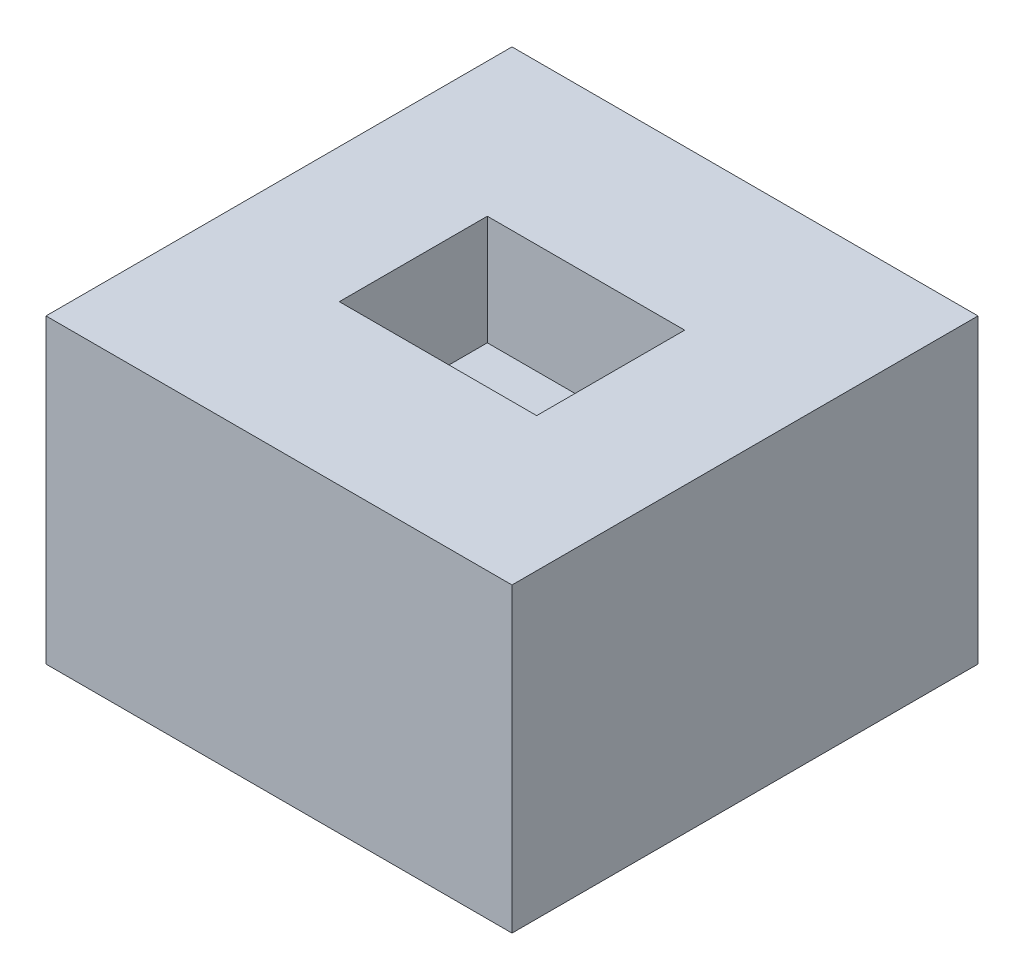
ISO-10303-21;
HEADER;
FILE_DESCRIPTION(('STEP AP214'),'2;1');
FILE_NAME('part.step','',(''),(''),'','','');
FILE_SCHEMA(('AUTOMOTIVE_DESIGN { 1 0 10303 214 1 1 1 1 }'));
ENDSEC;
DATA;
#1=APPLICATION_CONTEXT('core data for automotive mechanical design processes');
#2=APPLICATION_PROTOCOL_DEFINITION('international standard','automotive_design',2000,#1);
#3=PRODUCT_CONTEXT('',#1,'mechanical');
#4=PRODUCT('Part','Part','',(#3));
#5=PRODUCT_RELATED_PRODUCT_CATEGORY('part','',(#4));
#6=PRODUCT_DEFINITION_FORMATION('','',#4);
#7=PRODUCT_DEFINITION_CONTEXT('part definition',#1,'design');
#8=PRODUCT_DEFINITION('design','',#6,#7);
#9=PRODUCT_DEFINITION_SHAPE('','',#8);
#10=(LENGTH_UNIT() NAMED_UNIT(*) SI_UNIT(.MILLI.,.METRE.));
#11=(NAMED_UNIT(*) PLANE_ANGLE_UNIT() SI_UNIT($,.RADIAN.));
#12=(NAMED_UNIT(*) SI_UNIT($,.STERADIAN.) SOLID_ANGLE_UNIT());
#13=UNCERTAINTY_MEASURE_WITH_UNIT(LENGTH_MEASURE(1.E-05),#10,'distance_accuracy_value','');
#14=(GEOMETRIC_REPRESENTATION_CONTEXT(3) GLOBAL_UNCERTAINTY_ASSIGNED_CONTEXT((#13)) GLOBAL_UNIT_ASSIGNED_CONTEXT((#10,
#11,#12)) REPRESENTATION_CONTEXT('',''));
#15=CARTESIAN_POINT('',(0.,0.,0.));
#16=DIRECTION('',(0.,0.,1.));
#17=DIRECTION('',(1.,0.,0.));
#18=AXIS2_PLACEMENT_3D('',#15,#16,#17);
#19=CARTESIAN_POINT('',(-4.25,5.5,4.25));
#20=DIRECTION('',(1.,0.,0.));
#21=DIRECTION('',(0.,0.,-1.));
#22=AXIS2_PLACEMENT_3D('',#19,#20,#21);
#23=PLANE('',#22);
#24=DIRECTION('',(0.,0.,1.));
#25=VECTOR('',#24,1.);
#26=CARTESIAN_POINT('',(-4.25,0.,4.25));
#27=LINE('',#26,#25);
#28=CARTESIAN_POINT('',(-4.25,0.,-4.25));
#29=VERTEX_POINT('',#28);
#30=CARTESIAN_POINT('',(-4.25,0.,4.25));
#31=VERTEX_POINT('',#30);
#32=EDGE_CURVE('E145',#29,#31,#27,.T.);
#33=ORIENTED_EDGE('',*,*,#32,.T.);
#34=DIRECTION('',(0.,-1.,0.));
#35=VECTOR('',#34,1.);
#36=CARTESIAN_POINT('',(-4.25,5.5,4.25));
#37=LINE('',#36,#35);
#38=CARTESIAN_POINT('',(-4.25,5.5,4.25));
#39=VERTEX_POINT('',#38);
#40=EDGE_CURVE('E11',#39,#31,#37,.T.);
#41=ORIENTED_EDGE('',*,*,#40,.F.);
#42=DIRECTION('',(0.,0.,1.));
#43=VECTOR('',#42,1.);
#44=CARTESIAN_POINT('',(-4.25,5.5,4.25));
#45=LINE('',#44,#43);
#46=CARTESIAN_POINT('',(-4.25,5.5,-4.25));
#47=VERTEX_POINT('',#46);
#48=EDGE_CURVE('E149',#47,#39,#45,.T.);
#49=ORIENTED_EDGE('',*,*,#48,.F.);
#50=DIRECTION('',(0.,-1.,0.));
#51=VECTOR('',#50,1.);
#52=CARTESIAN_POINT('',(-4.25,5.5,-4.25));
#53=LINE('',#52,#51);
#54=EDGE_CURVE('E155',#47,#29,#53,.T.);
#55=ORIENTED_EDGE('',*,*,#54,.T.);
#56=EDGE_LOOP('',(#33,#41,#49,#55));
#57=FACE_BOUND('',#56,.T.);
#58=ADVANCED_FACE('F37',(#57),#23,.F.);
#59=CARTESIAN_POINT('',(4.25,5.5,4.25));
#60=DIRECTION('',(0.,0.,-1.));
#61=DIRECTION('',(-1.,0.,0.));
#62=AXIS2_PLACEMENT_3D('',#59,#60,#61);
#63=PLANE('',#62);
#64=DIRECTION('',(1.,0.,0.));
#65=VECTOR('',#64,1.);
#66=CARTESIAN_POINT('',(4.25,0.,4.25));
#67=LINE('',#66,#65);
#68=CARTESIAN_POINT('',(4.25,0.,4.25));
#69=VERTEX_POINT('',#68);
#70=EDGE_CURVE('E158',#31,#69,#67,.T.);
#71=ORIENTED_EDGE('',*,*,#70,.T.);
#72=DIRECTION('',(0.,-1.,0.));
#73=VECTOR('',#72,1.);
#74=CARTESIAN_POINT('',(4.25,5.5,4.25));
#75=LINE('',#74,#73);
#76=CARTESIAN_POINT('',(4.25,5.5,4.25));
#77=VERTEX_POINT('',#76);
#78=EDGE_CURVE('E44',#77,#69,#75,.T.);
#79=ORIENTED_EDGE('',*,*,#78,.F.);
#80=DIRECTION('',(1.,0.,0.));
#81=VECTOR('',#80,1.);
#82=CARTESIAN_POINT('',(4.25,5.5,4.25));
#83=LINE('',#82,#81);
#84=EDGE_CURVE('E88',#39,#77,#83,.T.);
#85=ORIENTED_EDGE('',*,*,#84,.F.);
#86=ORIENTED_EDGE('',*,*,#40,.T.);
#87=EDGE_LOOP('',(#71,#79,#85,#86));
#88=FACE_BOUND('',#87,.T.);
#89=ADVANCED_FACE('F188',(#88),#63,.F.);
#90=CARTESIAN_POINT('',(4.25,5.5,4.25));
#91=DIRECTION('',(-1.,0.,0.));
#92=DIRECTION('',(0.,0.,1.));
#93=AXIS2_PLACEMENT_3D('',#90,#91,#92);
#94=PLANE('',#93);
#95=DIRECTION('',(0.,0.,-1.));
#96=VECTOR('',#95,1.);
#97=CARTESIAN_POINT('',(4.25,0.,4.25));
#98=LINE('',#97,#96);
#99=CARTESIAN_POINT('',(4.25,0.,-4.25));
#100=VERTEX_POINT('',#99);
#101=EDGE_CURVE('E160',#69,#100,#98,.T.);
#102=ORIENTED_EDGE('',*,*,#101,.T.);
#103=DIRECTION('',(0.,-1.,0.));
#104=VECTOR('',#103,1.);
#105=CARTESIAN_POINT('',(4.25,5.5,-4.25));
#106=LINE('',#105,#104);
#107=CARTESIAN_POINT('',(4.25,5.5,-4.25));
#108=VERTEX_POINT('',#107);
#109=EDGE_CURVE('E164',#108,#100,#106,.T.);
#110=ORIENTED_EDGE('',*,*,#109,.F.);
#111=DIRECTION('',(0.,0.,-1.));
#112=VECTOR('',#111,1.);
#113=CARTESIAN_POINT('',(4.25,5.5,4.25));
#114=LINE('',#113,#112);
#115=EDGE_CURVE('E152',#77,#108,#114,.T.);
#116=ORIENTED_EDGE('',*,*,#115,.F.);
#117=ORIENTED_EDGE('',*,*,#78,.T.);
#118=EDGE_LOOP('',(#102,#110,#116,#117));
#119=FACE_BOUND('',#118,.T.);
#120=ADVANCED_FACE('F169',(#119),#94,.F.);
#121=CARTESIAN_POINT('',(4.25,5.5,-4.25));
#122=DIRECTION('',(0.,0.,1.));
#123=DIRECTION('',(1.,0.,0.));
#124=AXIS2_PLACEMENT_3D('',#121,#122,#123);
#125=PLANE('',#124);
#126=DIRECTION('',(-1.,0.,0.));
#127=VECTOR('',#126,1.);
#128=CARTESIAN_POINT('',(4.25,0.,-4.25));
#129=LINE('',#128,#127);
#130=EDGE_CURVE('E81',#100,#29,#129,.T.);
#131=ORIENTED_EDGE('',*,*,#130,.T.);
#132=ORIENTED_EDGE('',*,*,#54,.F.);
#133=DIRECTION('',(-1.,0.,0.));
#134=VECTOR('',#133,1.);
#135=CARTESIAN_POINT('',(4.25,5.5,-4.25));
#136=LINE('',#135,#134);
#137=EDGE_CURVE('E60',#108,#47,#136,.T.);
#138=ORIENTED_EDGE('',*,*,#137,.F.);
#139=ORIENTED_EDGE('',*,*,#109,.T.);
#140=EDGE_LOOP('',(#131,#132,#138,#139));
#141=FACE_BOUND('',#140,.T.);
#142=ADVANCED_FACE('F177',(#141),#125,.F.);
#143=CARTESIAN_POINT('',(0.,5.5,0.));
#144=DIRECTION('',(0.,1.,0.));
#145=DIRECTION('',(0.,0.,1.));
#146=AXIS2_PLACEMENT_3D('',#143,#144,#145);
#147=PLANE('',#146);
#148=DIRECTION('',(0.,0.,-1.));
#149=VECTOR('',#148,1.);
#150=CARTESIAN_POINT('',(1.8,5.5,1.35));
#151=LINE('',#150,#149);
#152=CARTESIAN_POINT('',(1.8,5.5,1.35));
#153=VERTEX_POINT('',#152);
#154=CARTESIAN_POINT('',(1.8,5.5,-1.35));
#155=VERTEX_POINT('',#154);
#156=EDGE_CURVE('E51',#153,#155,#151,.T.);
#157=ORIENTED_EDGE('',*,*,#156,.F.);
#158=DIRECTION('',(1.,0.,0.));
#159=VECTOR('',#158,1.);
#160=CARTESIAN_POINT('',(-1.8,5.5,1.35));
#161=LINE('',#160,#159);
#162=CARTESIAN_POINT('',(-1.8,5.5,1.35));
#163=VERTEX_POINT('',#162);
#164=EDGE_CURVE('E130',#163,#153,#161,.T.);
#165=ORIENTED_EDGE('',*,*,#164,.F.);
#166=DIRECTION('',(0.,0.,1.));
#167=VECTOR('',#166,1.);
#168=CARTESIAN_POINT('',(-1.8,5.5,1.35));
#169=LINE('',#168,#167);
#170=CARTESIAN_POINT('',(-1.8,5.5,-1.35));
#171=VERTEX_POINT('',#170);
#172=EDGE_CURVE('E133',#171,#163,#169,.T.);
#173=ORIENTED_EDGE('',*,*,#172,.F.);
#174=DIRECTION('',(-1.,0.,0.));
#175=VECTOR('',#174,1.);
#176=CARTESIAN_POINT('',(-1.8,5.5,-1.35));
#177=LINE('',#176,#175);
#178=EDGE_CURVE('E139',#155,#171,#177,.T.);
#179=ORIENTED_EDGE('',*,*,#178,.F.);
#180=EDGE_LOOP('',(#157,#165,#173,#179));
#181=FACE_BOUND('',#180,.T.);
#182=ORIENTED_EDGE('',*,*,#48,.T.);
#183=ORIENTED_EDGE('',*,*,#84,.T.);
#184=ORIENTED_EDGE('',*,*,#115,.T.);
#185=ORIENTED_EDGE('',*,*,#137,.T.);
#186=EDGE_LOOP('',(#182,#183,#184,#185));
#187=FACE_BOUND('',#186,.T.);
#188=ADVANCED_FACE('F179',(#181,#187),#147,.T.);
#189=CARTESIAN_POINT('',(0.,0.,0.));
#190=DIRECTION('',(0.,1.,0.));
#191=DIRECTION('',(0.,0.,1.));
#192=AXIS2_PLACEMENT_3D('',#189,#190,#191);
#193=PLANE('',#192);
#194=ORIENTED_EDGE('',*,*,#32,.F.);
#195=ORIENTED_EDGE('',*,*,#130,.F.);
#196=ORIENTED_EDGE('',*,*,#101,.F.);
#197=ORIENTED_EDGE('',*,*,#70,.F.);
#198=EDGE_LOOP('',(#194,#195,#196,#197));
#199=FACE_BOUND('',#198,.T.);
#200=ADVANCED_FACE('F173',(#199),#193,.F.);
#201=CARTESIAN_POINT('',(1.8,3.5,1.35));
#202=DIRECTION('',(1.,0.,0.));
#203=DIRECTION('',(0.,0.,-1.));
#204=AXIS2_PLACEMENT_3D('',#201,#202,#203);
#205=PLANE('',#204);
#206=ORIENTED_EDGE('',*,*,#156,.T.);
#207=DIRECTION('',(0.,1.,0.));
#208=VECTOR('',#207,1.);
#209=CARTESIAN_POINT('',(1.8,3.5,-1.35));
#210=LINE('',#209,#208);
#211=CARTESIAN_POINT('',(1.8,3.5,-1.35));
#212=VERTEX_POINT('',#211);
#213=EDGE_CURVE('E108',#212,#155,#210,.T.);
#214=ORIENTED_EDGE('',*,*,#213,.F.);
#215=DIRECTION('',(0.,0.,-1.));
#216=VECTOR('',#215,1.);
#217=CARTESIAN_POINT('',(1.8,3.5,1.35));
#218=LINE('',#217,#216);
#219=CARTESIAN_POINT('',(1.8,3.5,1.35));
#220=VERTEX_POINT('',#219);
#221=EDGE_CURVE('E112',#220,#212,#218,.T.);
#222=ORIENTED_EDGE('',*,*,#221,.F.);
#223=DIRECTION('',(0.,1.,0.));
#224=VECTOR('',#223,1.);
#225=CARTESIAN_POINT('',(1.8,3.5,1.35));
#226=LINE('',#225,#224);
#227=EDGE_CURVE('E143',#220,#153,#226,.T.);
#228=ORIENTED_EDGE('',*,*,#227,.T.);
#229=EDGE_LOOP('',(#206,#214,#222,#228));
#230=FACE_BOUND('',#229,.T.);
#231=ADVANCED_FACE('F110',(#230),#205,.F.);
#232=CARTESIAN_POINT('',(-1.8,3.5,1.35));
#233=DIRECTION('',(0.,0.,1.));
#234=DIRECTION('',(1.,0.,0.));
#235=AXIS2_PLACEMENT_3D('',#232,#233,#234);
#236=PLANE('',#235);
#237=ORIENTED_EDGE('',*,*,#164,.T.);
#238=ORIENTED_EDGE('',*,*,#227,.F.);
#239=DIRECTION('',(1.,0.,0.));
#240=VECTOR('',#239,1.);
#241=CARTESIAN_POINT('',(-1.8,3.5,1.35));
#242=LINE('',#241,#240);
#243=CARTESIAN_POINT('',(-1.8,3.5,1.35));
#244=VERTEX_POINT('',#243);
#245=EDGE_CURVE('E118',#244,#220,#242,.T.);
#246=ORIENTED_EDGE('',*,*,#245,.F.);
#247=DIRECTION('',(0.,1.,0.));
#248=VECTOR('',#247,1.);
#249=CARTESIAN_POINT('',(-1.8,3.5,1.35));
#250=LINE('',#249,#248);
#251=EDGE_CURVE('E146',#244,#163,#250,.T.);
#252=ORIENTED_EDGE('',*,*,#251,.T.);
#253=EDGE_LOOP('',(#237,#238,#246,#252));
#254=FACE_BOUND('',#253,.T.);
#255=ADVANCED_FACE('F227',(#254),#236,.F.);
#256=CARTESIAN_POINT('',(-1.8,3.5,1.35));
#257=DIRECTION('',(-1.,0.,0.));
#258=DIRECTION('',(0.,0.,1.));
#259=AXIS2_PLACEMENT_3D('',#256,#257,#258);
#260=PLANE('',#259);
#261=ORIENTED_EDGE('',*,*,#172,.T.);
#262=ORIENTED_EDGE('',*,*,#251,.F.);
#263=DIRECTION('',(0.,0.,1.));
#264=VECTOR('',#263,1.);
#265=CARTESIAN_POINT('',(-1.8,3.5,1.35));
#266=LINE('',#265,#264);
#267=CARTESIAN_POINT('',(-1.8,3.5,-1.35));
#268=VERTEX_POINT('',#267);
#269=EDGE_CURVE('E126',#268,#244,#266,.T.);
#270=ORIENTED_EDGE('',*,*,#269,.F.);
#271=DIRECTION('',(0.,1.,0.));
#272=VECTOR('',#271,1.);
#273=CARTESIAN_POINT('',(-1.8,3.5,-1.35));
#274=LINE('',#273,#272);
#275=EDGE_CURVE('E117',#268,#171,#274,.T.);
#276=ORIENTED_EDGE('',*,*,#275,.T.);
#277=EDGE_LOOP('',(#261,#262,#270,#276));
#278=FACE_BOUND('',#277,.T.);
#279=ADVANCED_FACE('F237',(#278),#260,.F.);
#280=CARTESIAN_POINT('',(-1.8,3.5,-1.35));
#281=DIRECTION('',(0.,0.,-1.));
#282=DIRECTION('',(-1.,0.,0.));
#283=AXIS2_PLACEMENT_3D('',#280,#281,#282);
#284=PLANE('',#283);
#285=ORIENTED_EDGE('',*,*,#178,.T.);
#286=ORIENTED_EDGE('',*,*,#275,.F.);
#287=DIRECTION('',(-1.,0.,0.));
#288=VECTOR('',#287,1.);
#289=CARTESIAN_POINT('',(-1.8,3.5,-1.35));
#290=LINE('',#289,#288);
#291=EDGE_CURVE('E121',#212,#268,#290,.T.);
#292=ORIENTED_EDGE('',*,*,#291,.F.);
#293=ORIENTED_EDGE('',*,*,#213,.T.);
#294=EDGE_LOOP('',(#285,#286,#292,#293));
#295=FACE_BOUND('',#294,.T.);
#296=ADVANCED_FACE('F122',(#295),#284,.F.);
#297=CARTESIAN_POINT('',(0.,3.5,0.));
#298=DIRECTION('',(0.,-1.,0.));
#299=DIRECTION('',(0.,0.,-1.));
#300=AXIS2_PLACEMENT_3D('',#297,#298,#299);
#301=PLANE('',#300);
#302=ORIENTED_EDGE('',*,*,#221,.T.);
#303=ORIENTED_EDGE('',*,*,#291,.T.);
#304=ORIENTED_EDGE('',*,*,#269,.T.);
#305=ORIENTED_EDGE('',*,*,#245,.T.);
#306=EDGE_LOOP('',(#302,#303,#304,#305));
#307=FACE_BOUND('',#306,.T.);
#308=ADVANCED_FACE('F128',(#307),#301,.F.);
#309=CLOSED_SHELL('',(#58,#89,#120,#142,#188,#200,#231,#255,#279,#296,#308));
#310=MANIFOLD_SOLID_BREP('B2',#309);
#311=ADVANCED_BREP_SHAPE_REPRESENTATION('',(#18,#310),#14);
#312=SHAPE_DEFINITION_REPRESENTATION(#9,#311);
ENDSEC;
END-ISO-10303-21;
